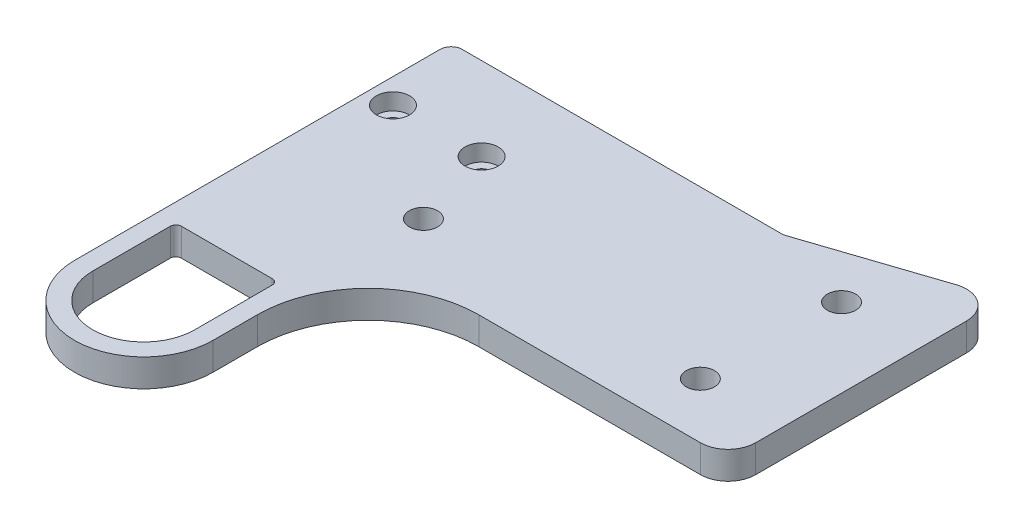
ISO-10303-21;
HEADER;
FILE_DESCRIPTION(('STEP AP214'),'2;1');
FILE_NAME('part.step','',(''),(''),'','','');
FILE_SCHEMA(('AUTOMOTIVE_DESIGN { 1 0 10303 214 1 1 1 1 }'));
ENDSEC;
DATA;
#1=APPLICATION_CONTEXT('core data for automotive mechanical design processes');
#2=APPLICATION_PROTOCOL_DEFINITION('international standard','automotive_design',2000,#1);
#3=PRODUCT_CONTEXT('',#1,'mechanical');
#4=PRODUCT('Part','Part','',(#3));
#5=PRODUCT_RELATED_PRODUCT_CATEGORY('part','',(#4));
#6=PRODUCT_DEFINITION_FORMATION('','',#4);
#7=PRODUCT_DEFINITION_CONTEXT('part definition',#1,'design');
#8=PRODUCT_DEFINITION('design','',#6,#7);
#9=PRODUCT_DEFINITION_SHAPE('','',#8);
#10=(LENGTH_UNIT() NAMED_UNIT(*) SI_UNIT(.MILLI.,.METRE.));
#11=(NAMED_UNIT(*) PLANE_ANGLE_UNIT() SI_UNIT($,.RADIAN.));
#12=(NAMED_UNIT(*) SI_UNIT($,.STERADIAN.) SOLID_ANGLE_UNIT());
#13=UNCERTAINTY_MEASURE_WITH_UNIT(LENGTH_MEASURE(1.E-05),#10,'distance_accuracy_value','');
#14=(GEOMETRIC_REPRESENTATION_CONTEXT(3) GLOBAL_UNCERTAINTY_ASSIGNED_CONTEXT((#13)) GLOBAL_UNIT_ASSIGNED_CONTEXT((#10,
#11,#12)) REPRESENTATION_CONTEXT('',''));
#15=CARTESIAN_POINT('',(0.,0.,0.));
#16=DIRECTION('',(0.,0.,1.));
#17=DIRECTION('',(1.,0.,0.));
#18=AXIS2_PLACEMENT_3D('',#15,#16,#17);
#19=CARTESIAN_POINT('',(12.5,5.,48.));
#20=DIRECTION('',(0.,1.,0.));
#21=DIRECTION('',(0.,0.,1.));
#22=AXIS2_PLACEMENT_3D('',#19,#20,#21);
#23=PLANE('',#22);
#24=CARTESIAN_POINT('',(4.50000000000001,5.,-4.99999999999998));
#25=DIRECTION('',(0.,-1.,0.));
#26=DIRECTION('',(0.,0.,-1.));
#27=AXIS2_PLACEMENT_3D('',#24,#25,#26);
#28=CIRCLE('',#27,3.);
#29=CARTESIAN_POINT('',(4.50000000000001,5.,-7.99999999999998));
#30=VERTEX_POINT('',#29);
#31=EDGE_CURVE('E391',#30,#30,#28,.T.);
#32=ORIENTED_EDGE('',*,*,#31,.T.);
#33=EDGE_LOOP('',(#32));
#34=FACE_BOUND('',#33,.T.);
#35=CARTESIAN_POINT('',(20.5,5.,-4.99999999999998));
#36=DIRECTION('',(0.,-1.,0.));
#37=DIRECTION('',(0.,0.,-1.));
#38=AXIS2_PLACEMENT_3D('',#35,#36,#37);
#39=CIRCLE('',#38,3.);
#40=CARTESIAN_POINT('',(20.5,5.,-7.99999999999998));
#41=VERTEX_POINT('',#40);
#42=EDGE_CURVE('E403',#41,#41,#39,.T.);
#43=ORIENTED_EDGE('',*,*,#42,.T.);
#44=EDGE_LOOP('',(#43));
#45=FACE_BOUND('',#44,.T.);
#46=CARTESIAN_POINT('',(4.30000000000001,5.,34.));
#47=DIRECTION('',(0.,1.,0.));
#48=DIRECTION('',(0.,0.,-1.));
#49=AXIS2_PLACEMENT_3D('',#46,#47,#48);
#50=CIRCLE('',#49,1.);
#51=CARTESIAN_POINT('',(4.30000000000001,5.,33.));
#52=VERTEX_POINT('',#51);
#53=CARTESIAN_POINT('',(3.30000000000001,5.,34.));
#54=VERTEX_POINT('',#53);
#55=EDGE_CURVE('E173',#52,#54,#50,.T.);
#56=ORIENTED_EDGE('',*,*,#55,.F.);
#57=DIRECTION('',(-1.,0.,0.));
#58=VECTOR('',#57,1.);
#59=CARTESIAN_POINT('',(4.30000000000001,5.,33.));
#60=LINE('',#59,#58);
#61=CARTESIAN_POINT('',(20.7,5.,33.));
#62=VERTEX_POINT('',#61);
#63=EDGE_CURVE('E195',#62,#52,#60,.T.);
#64=ORIENTED_EDGE('',*,*,#63,.F.);
#65=CARTESIAN_POINT('',(20.7,5.,34.));
#66=DIRECTION('',(0.,1.,0.));
#67=DIRECTION('',(0.,0.,-1.));
#68=AXIS2_PLACEMENT_3D('',#65,#66,#67);
#69=CIRCLE('',#68,1.);
#70=CARTESIAN_POINT('',(21.7,5.,34.));
#71=VERTEX_POINT('',#70);
#72=EDGE_CURVE('E199',#71,#62,#69,.T.);
#73=ORIENTED_EDGE('',*,*,#72,.F.);
#74=DIRECTION('',(0.,0.,-1.));
#75=VECTOR('',#74,1.);
#76=CARTESIAN_POINT('',(21.7,5.,34.));
#77=LINE('',#76,#75);
#78=CARTESIAN_POINT('',(21.7,5.,48.));
#79=VERTEX_POINT('',#78);
#80=EDGE_CURVE('E225',#79,#71,#77,.T.);
#81=ORIENTED_EDGE('',*,*,#80,.F.);
#82=CARTESIAN_POINT('',(12.5,5.,48.));
#83=DIRECTION('',(0.,1.,0.));
#84=DIRECTION('',(0.,0.,1.));
#85=AXIS2_PLACEMENT_3D('',#82,#83,#84);
#86=CIRCLE('',#85,9.2);
#87=CARTESIAN_POINT('',(3.30000000000001,5.,48.));
#88=VERTEX_POINT('',#87);
#89=EDGE_CURVE('E221',#88,#79,#86,.T.);
#90=ORIENTED_EDGE('',*,*,#89,.F.);
#91=DIRECTION('',(0.,0.,1.));
#92=VECTOR('',#91,1.);
#93=CARTESIAN_POINT('',(3.30000000000001,5.,48.));
#94=LINE('',#93,#92);
#95=EDGE_CURVE('E218',#54,#88,#94,.T.);
#96=ORIENTED_EDGE('',*,*,#95,.F.);
#97=EDGE_LOOP('',(#56,#64,#73,#81,#90,#96));
#98=FACE_BOUND('',#97,.T.);
#99=CARTESIAN_POINT('',(25.,5.,10.));
#100=DIRECTION('',(0.,1.,0.));
#101=DIRECTION('',(0.,0.,1.));
#102=AXIS2_PLACEMENT_3D('',#99,#100,#101);
#103=CIRCLE('',#102,2.55);
#104=CARTESIAN_POINT('',(25.,5.,12.55));
#105=VERTEX_POINT('',#104);
#106=EDGE_CURVE('E247',#105,#105,#103,.T.);
#107=ORIENTED_EDGE('',*,*,#106,.F.);
#108=EDGE_LOOP('',(#107));
#109=FACE_BOUND('',#108,.T.);
#110=CARTESIAN_POINT('',(75.7697505292423,5.,-14.7156579758528));
#111=DIRECTION('',(0.,1.,0.));
#112=DIRECTION('',(0.,0.,1.));
#113=AXIS2_PLACEMENT_3D('',#110,#111,#112);
#114=CIRCLE('',#113,2.54999999999999);
#115=CARTESIAN_POINT('',(75.7697505292423,5.,-12.1656579758528));
#116=VERTEX_POINT('',#115);
#117=EDGE_CURVE('E263',#116,#116,#114,.T.);
#118=ORIENTED_EDGE('',*,*,#117,.F.);
#119=EDGE_LOOP('',(#118));
#120=FACE_BOUND('',#119,.T.);
#121=DIRECTION('',(-1.,0.,0.));
#122=VECTOR('',#121,1.);
#123=CARTESIAN_POINT('',(0.,5.,-20.));
#124=LINE('',#123,#122);
#125=CARTESIAN_POINT('',(59.6754446796633,5.,-20.));
#126=VERTEX_POINT('',#125);
#127=CARTESIAN_POINT('',(2.,5.,-20.));
#128=VERTEX_POINT('',#127);
#129=EDGE_CURVE('E411',#126,#128,#124,.T.);
#130=ORIENTED_EDGE('',*,*,#129,.T.);
#131=CARTESIAN_POINT('',(2.,5.,-18.));
#132=DIRECTION('',(0.,1.,0.));
#133=DIRECTION('',(0.,0.,1.));
#134=AXIS2_PLACEMENT_3D('',#131,#132,#133);
#135=CIRCLE('',#134,2.);
#136=CARTESIAN_POINT('',(0.,5.,-18.));
#137=VERTEX_POINT('',#136);
#138=EDGE_CURVE('E65',#128,#137,#135,.T.);
#139=ORIENTED_EDGE('',*,*,#138,.T.);
#140=DIRECTION('',(0.,0.,1.));
#141=VECTOR('',#140,1.);
#142=CARTESIAN_POINT('',(0.,5.,0.));
#143=LINE('',#142,#141);
#144=CARTESIAN_POINT('',(0.,5.,48.));
#145=VERTEX_POINT('',#144);
#146=EDGE_CURVE('E275',#137,#145,#143,.T.);
#147=ORIENTED_EDGE('',*,*,#146,.T.);
#148=CARTESIAN_POINT('',(12.5,5.,48.));
#149=DIRECTION('',(0.,1.,0.));
#150=DIRECTION('',(0.,0.,1.));
#151=AXIS2_PLACEMENT_3D('',#148,#149,#150);
#152=CIRCLE('',#151,12.5);
#153=CARTESIAN_POINT('',(25.,5.,48.));
#154=VERTEX_POINT('',#153);
#155=EDGE_CURVE('E279',#145,#154,#152,.T.);
#156=ORIENTED_EDGE('',*,*,#155,.T.);
#157=DIRECTION('',(0.,0.,-1.));
#158=VECTOR('',#157,1.);
#159=CARTESIAN_POINT('',(25.,5.,48.));
#160=LINE('',#159,#158);
#161=CARTESIAN_POINT('',(25.,5.,40.));
#162=VERTEX_POINT('',#161);
#163=EDGE_CURVE('E282',#154,#162,#160,.T.);
#164=ORIENTED_EDGE('',*,*,#163,.T.);
#165=CARTESIAN_POINT('',(45.,5.,40.));
#166=DIRECTION('',(0.,1.,0.));
#167=DIRECTION('',(0.,0.,1.));
#168=AXIS2_PLACEMENT_3D('',#165,#166,#167);
#169=CIRCLE('',#168,20.);
#170=CARTESIAN_POINT('',(45.,5.,20.));
#171=VERTEX_POINT('',#170);
#172=EDGE_CURVE('E332',#162,#171,#169,.F.);
#173=ORIENTED_EDGE('',*,*,#172,.T.);
#174=DIRECTION('',(1.,0.,0.));
#175=VECTOR('',#174,1.);
#176=CARTESIAN_POINT('',(90.,5.,20.));
#177=LINE('',#176,#175);
#178=CARTESIAN_POINT('',(85.,5.,20.));
#179=VERTEX_POINT('',#178);
#180=EDGE_CURVE('E286',#171,#179,#177,.T.);
#181=ORIENTED_EDGE('',*,*,#180,.T.);
#182=CARTESIAN_POINT('',(85.,5.,15.));
#183=DIRECTION('',(0.,1.,0.));
#184=DIRECTION('',(0.,0.,1.));
#185=AXIS2_PLACEMENT_3D('',#182,#183,#184);
#186=CIRCLE('',#185,5.);
#187=CARTESIAN_POINT('',(90.,5.,15.));
#188=VERTEX_POINT('',#187);
#189=EDGE_CURVE('E354',#179,#188,#186,.T.);
#190=ORIENTED_EDGE('',*,*,#189,.T.);
#191=DIRECTION('',(0.,0.,-1.));
#192=VECTOR('',#191,1.);
#193=CARTESIAN_POINT('',(90.,5.,-30.));
#194=LINE('',#193,#192);
#195=CARTESIAN_POINT('',(90.,5.,-23.062870566386));
#196=VERTEX_POINT('',#195);
#197=EDGE_CURVE('E290',#188,#196,#194,.T.);
#198=ORIENTED_EDGE('',*,*,#197,.T.);
#199=CARTESIAN_POINT('',(85.,5.,-23.062870566386));
#200=DIRECTION('',(0.,1.,0.));
#201=DIRECTION('',(0.,0.,1.));
#202=AXIS2_PLACEMENT_3D('',#199,#200,#201);
#203=CIRCLE('',#202,5.);
#204=CARTESIAN_POINT('',(83.4188611699158,5.,-27.8062870566386));
#205=VERTEX_POINT('',#204);
#206=EDGE_CURVE('E351',#196,#205,#203,.T.);
#207=ORIENTED_EDGE('',*,*,#206,.T.);
#208=DIRECTION('',(-0.948683298050514,0.,0.316227766016838));
#209=VECTOR('',#208,1.);
#210=CARTESIAN_POINT('',(0.,5.,0.));
#211=LINE('',#210,#209);
#212=CARTESIAN_POINT('',(60.3079002116969,5.,-20.102633403899));
#213=VERTEX_POINT('',#212);
#214=EDGE_CURVE('E271',#205,#213,#211,.T.);
#215=ORIENTED_EDGE('',*,*,#214,.T.);
#216=CARTESIAN_POINT('',(59.6754446796633,5.,-22.));
#217=DIRECTION('',(0.,1.,0.));
#218=DIRECTION('',(0.,0.,1.));
#219=AXIS2_PLACEMENT_3D('',#216,#217,#218);
#220=CIRCLE('',#219,2.);
#221=EDGE_CURVE('E49',#213,#126,#220,.F.);
#222=ORIENTED_EDGE('',*,*,#221,.T.);
#223=EDGE_LOOP('',(#130,#139,#147,#156,#164,#173,#181,#190,#198,#207,#215,#222));
#224=FACE_BOUND('',#223,.T.);
#225=CARTESIAN_POINT('',(75.,5.,10.));
#226=DIRECTION('',(0.,1.,0.));
#227=DIRECTION('',(0.,0.,1.));
#228=AXIS2_PLACEMENT_3D('',#225,#226,#227);
#229=CIRCLE('',#228,2.54999999999999);
#230=CARTESIAN_POINT('',(75.,5.,12.55));
#231=VERTEX_POINT('',#230);
#232=EDGE_CURVE('E255',#231,#231,#229,.T.);
#233=ORIENTED_EDGE('',*,*,#232,.F.);
#234=EDGE_LOOP('',(#233));
#235=FACE_BOUND('',#234,.T.);
#236=ADVANCED_FACE('F39',(#34,#45,#98,#109,#120,#224,#235),#23,.T.);
#237=CARTESIAN_POINT('',(12.5,0.,48.));
#238=DIRECTION('',(0.,1.,0.));
#239=DIRECTION('',(0.,0.,1.));
#240=AXIS2_PLACEMENT_3D('',#237,#238,#239);
#241=PLANE('',#240);
#242=CARTESIAN_POINT('',(20.5,0.,-4.99999999999998));
#243=DIRECTION('',(0.,1.,0.));
#244=DIRECTION('',(0.,0.,1.));
#245=AXIS2_PLACEMENT_3D('',#242,#243,#244);
#246=CIRCLE('',#245,1.55);
#247=CARTESIAN_POINT('',(20.5,0.,-3.44999999999999));
#248=VERTEX_POINT('',#247);
#249=EDGE_CURVE('E407',#248,#248,#246,.T.);
#250=ORIENTED_EDGE('',*,*,#249,.T.);
#251=EDGE_LOOP('',(#250));
#252=FACE_BOUND('',#251,.T.);
#253=CARTESIAN_POINT('',(4.50000000000001,0.,-4.99999999999998));
#254=DIRECTION('',(0.,1.,0.));
#255=DIRECTION('',(0.,0.,-1.));
#256=AXIS2_PLACEMENT_3D('',#253,#254,#255);
#257=CIRCLE('',#256,1.55);
#258=CARTESIAN_POINT('',(4.50000000000001,0.,-6.54999999999998));
#259=VERTEX_POINT('',#258);
#260=EDGE_CURVE('E389',#259,#259,#257,.T.);
#261=ORIENTED_EDGE('',*,*,#260,.T.);
#262=EDGE_LOOP('',(#261));
#263=FACE_BOUND('',#262,.T.);
#264=DIRECTION('',(-1.,0.,0.));
#265=VECTOR('',#264,1.);
#266=CARTESIAN_POINT('',(4.30000000000001,0.,33.));
#267=LINE('',#266,#265);
#268=CARTESIAN_POINT('',(20.7,0.,33.));
#269=VERTEX_POINT('',#268);
#270=CARTESIAN_POINT('',(4.30000000000001,0.,33.));
#271=VERTEX_POINT('',#270);
#272=EDGE_CURVE('E179',#269,#271,#267,.T.);
#273=ORIENTED_EDGE('',*,*,#272,.T.);
#274=CARTESIAN_POINT('',(4.30000000000001,0.,34.));
#275=DIRECTION('',(0.,1.,0.));
#276=DIRECTION('',(0.,0.,-1.));
#277=AXIS2_PLACEMENT_3D('',#274,#275,#276);
#278=CIRCLE('',#277,1.);
#279=CARTESIAN_POINT('',(3.30000000000001,0.,34.));
#280=VERTEX_POINT('',#279);
#281=EDGE_CURVE('E170',#271,#280,#278,.T.);
#282=ORIENTED_EDGE('',*,*,#281,.T.);
#283=DIRECTION('',(0.,0.,1.));
#284=VECTOR('',#283,1.);
#285=CARTESIAN_POINT('',(3.30000000000001,0.,48.));
#286=LINE('',#285,#284);
#287=CARTESIAN_POINT('',(3.30000000000001,0.,48.));
#288=VERTEX_POINT('',#287);
#289=EDGE_CURVE('E183',#280,#288,#286,.T.);
#290=ORIENTED_EDGE('',*,*,#289,.T.);
#291=CARTESIAN_POINT('',(12.5,0.,48.));
#292=DIRECTION('',(0.,1.,0.));
#293=DIRECTION('',(0.,0.,1.));
#294=AXIS2_PLACEMENT_3D('',#291,#292,#293);
#295=CIRCLE('',#294,9.2);
#296=CARTESIAN_POINT('',(21.7,0.,48.));
#297=VERTEX_POINT('',#296);
#298=EDGE_CURVE('E188',#288,#297,#295,.T.);
#299=ORIENTED_EDGE('',*,*,#298,.T.);
#300=DIRECTION('',(0.,0.,-1.));
#301=VECTOR('',#300,1.);
#302=CARTESIAN_POINT('',(21.7,0.,34.));
#303=LINE('',#302,#301);
#304=CARTESIAN_POINT('',(21.7,0.,34.));
#305=VERTEX_POINT('',#304);
#306=EDGE_CURVE('E207',#297,#305,#303,.T.);
#307=ORIENTED_EDGE('',*,*,#306,.T.);
#308=CARTESIAN_POINT('',(20.7,0.,34.));
#309=DIRECTION('',(0.,1.,0.));
#310=DIRECTION('',(0.,0.,-1.));
#311=AXIS2_PLACEMENT_3D('',#308,#309,#310);
#312=CIRCLE('',#311,1.);
#313=EDGE_CURVE('E211',#305,#269,#312,.T.);
#314=ORIENTED_EDGE('',*,*,#313,.T.);
#315=EDGE_LOOP('',(#273,#282,#290,#299,#307,#314));
#316=FACE_BOUND('',#315,.T.);
#317=DIRECTION('',(0.,0.,1.));
#318=VECTOR('',#317,1.);
#319=CARTESIAN_POINT('',(0.,0.,0.));
#320=LINE('',#319,#318);
#321=CARTESIAN_POINT('',(0.,0.,-18.));
#322=VERTEX_POINT('',#321);
#323=CARTESIAN_POINT('',(0.,0.,48.));
#324=VERTEX_POINT('',#323);
#325=EDGE_CURVE('E298',#322,#324,#320,.T.);
#326=ORIENTED_EDGE('',*,*,#325,.F.);
#327=CARTESIAN_POINT('',(2.,0.,-18.));
#328=DIRECTION('',(0.,1.,0.));
#329=DIRECTION('',(0.,0.,1.));
#330=AXIS2_PLACEMENT_3D('',#327,#328,#329);
#331=CIRCLE('',#330,2.);
#332=CARTESIAN_POINT('',(2.,0.,-20.));
#333=VERTEX_POINT('',#332);
#334=EDGE_CURVE('E376',#322,#333,#331,.F.);
#335=ORIENTED_EDGE('',*,*,#334,.T.);
#336=DIRECTION('',(1.,0.,0.));
#337=VECTOR('',#336,1.);
#338=CARTESIAN_POINT('',(0.,0.,-20.));
#339=LINE('',#338,#337);
#340=CARTESIAN_POINT('',(59.6754446796633,0.,-20.));
#341=VERTEX_POINT('',#340);
#342=EDGE_CURVE('E202',#333,#341,#339,.T.);
#343=ORIENTED_EDGE('',*,*,#342,.T.);
#344=CARTESIAN_POINT('',(59.6754446796633,0.,-22.));
#345=DIRECTION('',(0.,1.,0.));
#346=DIRECTION('',(0.,0.,1.));
#347=AXIS2_PLACEMENT_3D('',#344,#345,#346);
#348=CIRCLE('',#347,2.);
#349=CARTESIAN_POINT('',(60.3079002116969,0.,-20.102633403899));
#350=VERTEX_POINT('',#349);
#351=EDGE_CURVE('E11',#341,#350,#348,.T.);
#352=ORIENTED_EDGE('',*,*,#351,.T.);
#353=DIRECTION('',(-0.948683298050514,0.,0.316227766016838));
#354=VECTOR('',#353,1.);
#355=CARTESIAN_POINT('',(0.,0.,0.));
#356=LINE('',#355,#354);
#357=CARTESIAN_POINT('',(83.4188611699158,0.,-27.8062870566386));
#358=VERTEX_POINT('',#357);
#359=EDGE_CURVE('E267',#358,#350,#356,.T.);
#360=ORIENTED_EDGE('',*,*,#359,.F.);
#361=CARTESIAN_POINT('',(85.,0.,-23.062870566386));
#362=DIRECTION('',(0.,1.,0.));
#363=DIRECTION('',(0.,0.,1.));
#364=AXIS2_PLACEMENT_3D('',#361,#362,#363);
#365=CIRCLE('',#364,5.);
#366=CARTESIAN_POINT('',(90.,0.,-23.062870566386));
#367=VERTEX_POINT('',#366);
#368=EDGE_CURVE('E342',#358,#367,#365,.F.);
#369=ORIENTED_EDGE('',*,*,#368,.T.);
#370=DIRECTION('',(0.,0.,-1.));
#371=VECTOR('',#370,1.);
#372=CARTESIAN_POINT('',(90.,0.,-30.));
#373=LINE('',#372,#371);
#374=CARTESIAN_POINT('',(90.,0.,15.));
#375=VERTEX_POINT('',#374);
#376=EDGE_CURVE('E276',#375,#367,#373,.T.);
#377=ORIENTED_EDGE('',*,*,#376,.F.);
#378=CARTESIAN_POINT('',(85.,0.,15.));
#379=DIRECTION('',(0.,1.,0.));
#380=DIRECTION('',(0.,0.,1.));
#381=AXIS2_PLACEMENT_3D('',#378,#379,#380);
#382=CIRCLE('',#381,5.);
#383=CARTESIAN_POINT('',(85.,0.,20.));
#384=VERTEX_POINT('',#383);
#385=EDGE_CURVE('E345',#375,#384,#382,.F.);
#386=ORIENTED_EDGE('',*,*,#385,.T.);
#387=DIRECTION('',(1.,0.,0.));
#388=VECTOR('',#387,1.);
#389=CARTESIAN_POINT('',(90.,0.,20.));
#390=LINE('',#389,#388);
#391=CARTESIAN_POINT('',(45.,0.,20.));
#392=VERTEX_POINT('',#391);
#393=EDGE_CURVE('E308',#392,#384,#390,.T.);
#394=ORIENTED_EDGE('',*,*,#393,.F.);
#395=CARTESIAN_POINT('',(45.,0.,40.));
#396=DIRECTION('',(0.,1.,0.));
#397=DIRECTION('',(0.,0.,1.));
#398=AXIS2_PLACEMENT_3D('',#395,#396,#397);
#399=CIRCLE('',#398,20.);
#400=CARTESIAN_POINT('',(25.,0.,40.));
#401=VERTEX_POINT('',#400);
#402=EDGE_CURVE('E329',#392,#401,#399,.T.);
#403=ORIENTED_EDGE('',*,*,#402,.T.);
#404=DIRECTION('',(0.,0.,-1.));
#405=VECTOR('',#404,1.);
#406=CARTESIAN_POINT('',(25.,0.,48.));
#407=LINE('',#406,#405);
#408=CARTESIAN_POINT('',(25.,0.,48.));
#409=VERTEX_POINT('',#408);
#410=EDGE_CURVE('E304',#409,#401,#407,.T.);
#411=ORIENTED_EDGE('',*,*,#410,.F.);
#412=CARTESIAN_POINT('',(12.5,0.,48.));
#413=DIRECTION('',(0.,1.,0.));
#414=DIRECTION('',(0.,0.,1.));
#415=AXIS2_PLACEMENT_3D('',#412,#413,#414);
#416=CIRCLE('',#415,12.5);
#417=EDGE_CURVE('E301',#324,#409,#416,.T.);
#418=ORIENTED_EDGE('',*,*,#417,.F.);
#419=EDGE_LOOP('',(#326,#335,#343,#352,#360,#369,#377,#386,#394,#403,#411,#418));
#420=FACE_BOUND('',#419,.T.);
#421=CARTESIAN_POINT('',(75.7697505292423,0.,-14.7156579758528));
#422=DIRECTION('',(0.,1.,0.));
#423=DIRECTION('',(0.,0.,1.));
#424=AXIS2_PLACEMENT_3D('',#421,#422,#423);
#425=CIRCLE('',#424,2.54999999999999);
#426=CARTESIAN_POINT('',(75.7697505292423,0.,-12.1656579758528));
#427=VERTEX_POINT('',#426);
#428=EDGE_CURVE('E259',#427,#427,#425,.T.);
#429=ORIENTED_EDGE('',*,*,#428,.T.);
#430=EDGE_LOOP('',(#429));
#431=FACE_BOUND('',#430,.T.);
#432=CARTESIAN_POINT('',(75.,0.,10.));
#433=DIRECTION('',(0.,1.,0.));
#434=DIRECTION('',(0.,0.,1.));
#435=AXIS2_PLACEMENT_3D('',#432,#433,#434);
#436=CIRCLE('',#435,2.54999999999999);
#437=CARTESIAN_POINT('',(75.,0.,12.55));
#438=VERTEX_POINT('',#437);
#439=EDGE_CURVE('E251',#438,#438,#436,.T.);
#440=ORIENTED_EDGE('',*,*,#439,.T.);
#441=EDGE_LOOP('',(#440));
#442=FACE_BOUND('',#441,.T.);
#443=CARTESIAN_POINT('',(25.,0.,10.));
#444=DIRECTION('',(0.,1.,0.));
#445=DIRECTION('',(0.,0.,1.));
#446=AXIS2_PLACEMENT_3D('',#443,#444,#445);
#447=CIRCLE('',#446,2.55);
#448=CARTESIAN_POINT('',(25.,0.,12.55));
#449=VERTEX_POINT('',#448);
#450=EDGE_CURVE('E235',#449,#449,#447,.T.);
#451=ORIENTED_EDGE('',*,*,#450,.T.);
#452=EDGE_LOOP('',(#451));
#453=FACE_BOUND('',#452,.T.);
#454=ADVANCED_FACE('F190',(#252,#263,#316,#420,#431,#442,#453),#241,.F.);
#455=CARTESIAN_POINT('',(0.,5.,0.));
#456=DIRECTION('',(0.316227766016838,0.,0.948683298050514));
#457=DIRECTION('',(0.948683298050514,0.,-0.316227766016838));
#458=AXIS2_PLACEMENT_3D('',#455,#456,#457);
#459=PLANE('',#458);
#460=ORIENTED_EDGE('',*,*,#359,.T.);
#461=DIRECTION('',(0.,1.,0.));
#462=VECTOR('',#461,1.);
#463=CARTESIAN_POINT('',(60.3079002116969,5.,-20.102633403899));
#464=LINE('',#463,#462);
#465=EDGE_CURVE('E361',#350,#213,#464,.T.);
#466=ORIENTED_EDGE('',*,*,#465,.T.);
#467=ORIENTED_EDGE('',*,*,#214,.F.);
#468=DIRECTION('',(0.,-1.,0.));
#469=VECTOR('',#468,1.);
#470=CARTESIAN_POINT('',(83.4188611699158,5.,-27.8062870566386));
#471=LINE('',#470,#469);
#472=EDGE_CURVE('E357',#205,#358,#471,.T.);
#473=ORIENTED_EDGE('',*,*,#472,.T.);
#474=EDGE_LOOP('',(#460,#466,#467,#473));
#475=FACE_BOUND('',#474,.T.);
#476=ADVANCED_FACE('F431',(#475),#459,.F.);
#477=CARTESIAN_POINT('',(0.,5.,0.));
#478=DIRECTION('',(1.,0.,0.));
#479=DIRECTION('',(0.,0.,-1.));
#480=AXIS2_PLACEMENT_3D('',#477,#478,#479);
#481=PLANE('',#480);
#482=ORIENTED_EDGE('',*,*,#146,.F.);
#483=DIRECTION('',(0.,1.,0.));
#484=VECTOR('',#483,1.);
#485=CARTESIAN_POINT('',(0.,0.,-18.));
#486=LINE('',#485,#484);
#487=EDGE_CURVE('E57',#137,#322,#486,.F.);
#488=ORIENTED_EDGE('',*,*,#487,.T.);
#489=ORIENTED_EDGE('',*,*,#325,.T.);
#490=DIRECTION('',(0.,-1.,0.));
#491=VECTOR('',#490,1.);
#492=CARTESIAN_POINT('',(0.,5.,48.));
#493=LINE('',#492,#491);
#494=EDGE_CURVE('E318',#145,#324,#493,.T.);
#495=ORIENTED_EDGE('',*,*,#494,.F.);
#496=EDGE_LOOP('',(#482,#488,#489,#495));
#497=FACE_BOUND('',#496,.T.);
#498=ADVANCED_FACE('F502',(#497),#481,.F.);
#499=CARTESIAN_POINT('',(12.5,5.,48.));
#500=DIRECTION('',(0.,-1.,0.));
#501=DIRECTION('',(0.,0.,-1.));
#502=AXIS2_PLACEMENT_3D('',#499,#500,#501);
#503=CYLINDRICAL_SURFACE('',#502,12.5);
#504=ORIENTED_EDGE('',*,*,#417,.T.);
#505=DIRECTION('',(0.,-1.,0.));
#506=VECTOR('',#505,1.);
#507=CARTESIAN_POINT('',(25.,5.,48.));
#508=LINE('',#507,#506);
#509=EDGE_CURVE('E294',#154,#409,#508,.T.);
#510=ORIENTED_EDGE('',*,*,#509,.F.);
#511=ORIENTED_EDGE('',*,*,#155,.F.);
#512=ORIENTED_EDGE('',*,*,#494,.T.);
#513=EDGE_LOOP('',(#504,#510,#511,#512));
#514=FACE_BOUND('',#513,.T.);
#515=ADVANCED_FACE('F464',(#514),#503,.T.);
#516=CARTESIAN_POINT('',(25.,5.,48.));
#517=DIRECTION('',(-1.,0.,0.));
#518=DIRECTION('',(0.,0.,1.));
#519=AXIS2_PLACEMENT_3D('',#516,#517,#518);
#520=PLANE('',#519);
#521=ORIENTED_EDGE('',*,*,#410,.T.);
#522=DIRECTION('',(0.,-1.,0.));
#523=VECTOR('',#522,1.);
#524=CARTESIAN_POINT('',(25.,5.,40.));
#525=LINE('',#524,#523);
#526=EDGE_CURVE('E326',#401,#162,#525,.F.);
#527=ORIENTED_EDGE('',*,*,#526,.T.);
#528=ORIENTED_EDGE('',*,*,#163,.F.);
#529=ORIENTED_EDGE('',*,*,#509,.T.);
#530=EDGE_LOOP('',(#521,#527,#528,#529));
#531=FACE_BOUND('',#530,.T.);
#532=ADVANCED_FACE('F459',(#531),#520,.F.);
#533=CARTESIAN_POINT('',(90.,5.,20.));
#534=DIRECTION('',(0.,0.,-1.));
#535=DIRECTION('',(-1.,0.,0.));
#536=AXIS2_PLACEMENT_3D('',#533,#534,#535);
#537=PLANE('',#536);
#538=ORIENTED_EDGE('',*,*,#393,.T.);
#539=DIRECTION('',(0.,-1.,0.));
#540=VECTOR('',#539,1.);
#541=CARTESIAN_POINT('',(85.,5.,20.));
#542=LINE('',#541,#540);
#543=EDGE_CURVE('E348',#384,#179,#542,.F.);
#544=ORIENTED_EDGE('',*,*,#543,.T.);
#545=ORIENTED_EDGE('',*,*,#180,.F.);
#546=DIRECTION('',(0.,-1.,0.));
#547=VECTOR('',#546,1.);
#548=CARTESIAN_POINT('',(45.,0.,20.));
#549=LINE('',#548,#547);
#550=EDGE_CURVE('E322',#171,#392,#549,.T.);
#551=ORIENTED_EDGE('',*,*,#550,.T.);
#552=EDGE_LOOP('',(#538,#544,#545,#551));
#553=FACE_BOUND('',#552,.T.);
#554=ADVANCED_FACE('F449',(#553),#537,.F.);
#555=CARTESIAN_POINT('',(90.,5.,-30.));
#556=DIRECTION('',(-1.,0.,0.));
#557=DIRECTION('',(0.,0.,1.));
#558=AXIS2_PLACEMENT_3D('',#555,#556,#557);
#559=PLANE('',#558);
#560=ORIENTED_EDGE('',*,*,#197,.F.);
#561=DIRECTION('',(0.,-1.,0.));
#562=VECTOR('',#561,1.);
#563=CARTESIAN_POINT('',(90.,5.,15.));
#564=LINE('',#563,#562);
#565=EDGE_CURVE('E338',#188,#375,#564,.T.);
#566=ORIENTED_EDGE('',*,*,#565,.T.);
#567=ORIENTED_EDGE('',*,*,#376,.T.);
#568=DIRECTION('',(0.,-1.,0.));
#569=VECTOR('',#568,1.);
#570=CARTESIAN_POINT('',(90.,5.,-23.062870566386));
#571=LINE('',#570,#569);
#572=EDGE_CURVE('E335',#367,#196,#571,.F.);
#573=ORIENTED_EDGE('',*,*,#572,.T.);
#574=EDGE_LOOP('',(#560,#566,#567,#573));
#575=FACE_BOUND('',#574,.T.);
#576=ADVANCED_FACE('F441',(#575),#559,.F.);
#577=CARTESIAN_POINT('',(75.7697505292423,5.,-14.7156579758528));
#578=DIRECTION('',(0.,-1.,0.));
#579=DIRECTION('',(0.,0.,-1.));
#580=AXIS2_PLACEMENT_3D('',#577,#578,#579);
#581=CYLINDRICAL_SURFACE('',#580,2.54999999999999);
#582=ORIENTED_EDGE('',*,*,#117,.T.);
#583=EDGE_LOOP('',(#582));
#584=FACE_BOUND('',#583,.T.);
#585=ORIENTED_EDGE('',*,*,#428,.F.);
#586=EDGE_LOOP('',(#585));
#587=FACE_BOUND('',#586,.T.);
#588=ADVANCED_FACE('F491',(#584,#587),#581,.F.);
#589=CARTESIAN_POINT('',(75.,5.,10.));
#590=DIRECTION('',(0.,-1.,0.));
#591=DIRECTION('',(0.,0.,-1.));
#592=AXIS2_PLACEMENT_3D('',#589,#590,#591);
#593=CYLINDRICAL_SURFACE('',#592,2.54999999999999);
#594=ORIENTED_EDGE('',*,*,#232,.T.);
#595=EDGE_LOOP('',(#594));
#596=FACE_BOUND('',#595,.T.);
#597=ORIENTED_EDGE('',*,*,#439,.F.);
#598=EDGE_LOOP('',(#597));
#599=FACE_BOUND('',#598,.T.);
#600=ADVANCED_FACE('F683',(#596,#599),#593,.F.);
#601=CARTESIAN_POINT('',(25.,5.,10.));
#602=DIRECTION('',(0.,-1.,0.));
#603=DIRECTION('',(0.,0.,-1.));
#604=AXIS2_PLACEMENT_3D('',#601,#602,#603);
#605=CYLINDRICAL_SURFACE('',#604,2.55);
#606=ORIENTED_EDGE('',*,*,#106,.T.);
#607=EDGE_LOOP('',(#606));
#608=FACE_BOUND('',#607,.T.);
#609=ORIENTED_EDGE('',*,*,#450,.F.);
#610=EDGE_LOOP('',(#609));
#611=FACE_BOUND('',#610,.T.);
#612=ADVANCED_FACE('F509',(#608,#611),#605,.F.);
#613=CARTESIAN_POINT('',(45.,5.,40.));
#614=DIRECTION('',(0.,1.,0.));
#615=DIRECTION('',(0.,0.,1.));
#616=AXIS2_PLACEMENT_3D('',#613,#614,#615);
#617=CYLINDRICAL_SURFACE('',#616,20.);
#618=ORIENTED_EDGE('',*,*,#172,.F.);
#619=ORIENTED_EDGE('',*,*,#526,.F.);
#620=ORIENTED_EDGE('',*,*,#402,.F.);
#621=ORIENTED_EDGE('',*,*,#550,.F.);
#622=EDGE_LOOP('',(#618,#619,#620,#621));
#623=FACE_BOUND('',#622,.T.);
#624=ADVANCED_FACE('F454',(#623),#617,.F.);
#625=CARTESIAN_POINT('',(85.,5.,15.));
#626=DIRECTION('',(0.,-1.,0.));
#627=DIRECTION('',(0.,0.,-1.));
#628=AXIS2_PLACEMENT_3D('',#625,#626,#627);
#629=CYLINDRICAL_SURFACE('',#628,5.);
#630=ORIENTED_EDGE('',*,*,#189,.F.);
#631=ORIENTED_EDGE('',*,*,#543,.F.);
#632=ORIENTED_EDGE('',*,*,#385,.F.);
#633=ORIENTED_EDGE('',*,*,#565,.F.);
#634=EDGE_LOOP('',(#630,#631,#632,#633));
#635=FACE_BOUND('',#634,.T.);
#636=ADVANCED_FACE('F445',(#635),#629,.T.);
#637=CARTESIAN_POINT('',(85.,5.,-23.062870566386));
#638=DIRECTION('',(0.,-1.,0.));
#639=DIRECTION('',(0.,0.,-1.));
#640=AXIS2_PLACEMENT_3D('',#637,#638,#639);
#641=CYLINDRICAL_SURFACE('',#640,5.);
#642=ORIENTED_EDGE('',*,*,#206,.F.);
#643=ORIENTED_EDGE('',*,*,#572,.F.);
#644=ORIENTED_EDGE('',*,*,#368,.F.);
#645=ORIENTED_EDGE('',*,*,#472,.F.);
#646=EDGE_LOOP('',(#642,#643,#644,#645));
#647=FACE_BOUND('',#646,.T.);
#648=ADVANCED_FACE('F438',(#647),#641,.T.);
#649=CARTESIAN_POINT('',(4.30000000000001,0.,34.));
#650=DIRECTION('',(0.,1.,0.));
#651=DIRECTION('',(0.,0.,1.));
#652=AXIS2_PLACEMENT_3D('',#649,#650,#651);
#653=CYLINDRICAL_SURFACE('',#652,1.);
#654=ORIENTED_EDGE('',*,*,#55,.T.);
#655=DIRECTION('',(0.,1.,0.));
#656=VECTOR('',#655,1.);
#657=CARTESIAN_POINT('',(3.30000000000001,0.,34.));
#658=LINE('',#657,#656);
#659=EDGE_CURVE('E166',#280,#54,#658,.T.);
#660=ORIENTED_EDGE('',*,*,#659,.F.);
#661=ORIENTED_EDGE('',*,*,#281,.F.);
#662=DIRECTION('',(0.,1.,0.));
#663=VECTOR('',#662,1.);
#664=CARTESIAN_POINT('',(4.30000000000001,0.,33.));
#665=LINE('',#664,#663);
#666=EDGE_CURVE('E232',#271,#52,#665,.T.);
#667=ORIENTED_EDGE('',*,*,#666,.T.);
#668=EDGE_LOOP('',(#654,#660,#661,#667));
#669=FACE_BOUND('',#668,.T.);
#670=ADVANCED_FACE('F168',(#669),#653,.F.);
#671=CARTESIAN_POINT('',(4.30000000000001,0.,33.));
#672=DIRECTION('',(0.,0.,-1.));
#673=DIRECTION('',(-1.,0.,0.));
#674=AXIS2_PLACEMENT_3D('',#671,#672,#673);
#675=PLANE('',#674);
#676=ORIENTED_EDGE('',*,*,#63,.T.);
#677=ORIENTED_EDGE('',*,*,#666,.F.);
#678=ORIENTED_EDGE('',*,*,#272,.F.);
#679=DIRECTION('',(0.,1.,0.));
#680=VECTOR('',#679,1.);
#681=CARTESIAN_POINT('',(20.7,0.,33.));
#682=LINE('',#681,#680);
#683=EDGE_CURVE('E236',#269,#62,#682,.T.);
#684=ORIENTED_EDGE('',*,*,#683,.T.);
#685=EDGE_LOOP('',(#676,#677,#678,#684));
#686=FACE_BOUND('',#685,.T.);
#687=ADVANCED_FACE('F642',(#686),#675,.F.);
#688=CARTESIAN_POINT('',(20.7,0.,34.));
#689=DIRECTION('',(0.,1.,0.));
#690=DIRECTION('',(0.,0.,1.));
#691=AXIS2_PLACEMENT_3D('',#688,#689,#690);
#692=CYLINDRICAL_SURFACE('',#691,1.);
#693=ORIENTED_EDGE('',*,*,#72,.T.);
#694=ORIENTED_EDGE('',*,*,#683,.F.);
#695=ORIENTED_EDGE('',*,*,#313,.F.);
#696=DIRECTION('',(0.,1.,0.));
#697=VECTOR('',#696,1.);
#698=CARTESIAN_POINT('',(21.7,0.,34.));
#699=LINE('',#698,#697);
#700=EDGE_CURVE('E239',#305,#71,#699,.T.);
#701=ORIENTED_EDGE('',*,*,#700,.T.);
#702=EDGE_LOOP('',(#693,#694,#695,#701));
#703=FACE_BOUND('',#702,.T.);
#704=ADVANCED_FACE('F633',(#703),#692,.F.);
#705=CARTESIAN_POINT('',(21.7,0.,34.));
#706=DIRECTION('',(1.,0.,0.));
#707=DIRECTION('',(0.,0.,-1.));
#708=AXIS2_PLACEMENT_3D('',#705,#706,#707);
#709=PLANE('',#708);
#710=ORIENTED_EDGE('',*,*,#80,.T.);
#711=ORIENTED_EDGE('',*,*,#700,.F.);
#712=ORIENTED_EDGE('',*,*,#306,.F.);
#713=DIRECTION('',(0.,1.,0.));
#714=VECTOR('',#713,1.);
#715=CARTESIAN_POINT('',(21.7,0.,48.));
#716=LINE('',#715,#714);
#717=EDGE_CURVE('E242',#297,#79,#716,.T.);
#718=ORIENTED_EDGE('',*,*,#717,.T.);
#719=EDGE_LOOP('',(#710,#711,#712,#718));
#720=FACE_BOUND('',#719,.T.);
#721=ADVANCED_FACE('F624',(#720),#709,.F.);
#722=CARTESIAN_POINT('',(12.5,0.,48.));
#723=DIRECTION('',(0.,1.,0.));
#724=DIRECTION('',(0.,0.,1.));
#725=AXIS2_PLACEMENT_3D('',#722,#723,#724);
#726=CYLINDRICAL_SURFACE('',#725,9.2);
#727=ORIENTED_EDGE('',*,*,#89,.T.);
#728=ORIENTED_EDGE('',*,*,#717,.F.);
#729=ORIENTED_EDGE('',*,*,#298,.F.);
#730=DIRECTION('',(0.,1.,0.));
#731=VECTOR('',#730,1.);
#732=CARTESIAN_POINT('',(3.30000000000001,0.,48.));
#733=LINE('',#732,#731);
#734=EDGE_CURVE('E178',#288,#88,#733,.T.);
#735=ORIENTED_EDGE('',*,*,#734,.T.);
#736=EDGE_LOOP('',(#727,#728,#729,#735));
#737=FACE_BOUND('',#736,.T.);
#738=ADVANCED_FACE('F478',(#737),#726,.F.);
#739=CARTESIAN_POINT('',(3.30000000000001,0.,48.));
#740=DIRECTION('',(-1.,0.,0.));
#741=DIRECTION('',(0.,0.,1.));
#742=AXIS2_PLACEMENT_3D('',#739,#740,#741);
#743=PLANE('',#742);
#744=ORIENTED_EDGE('',*,*,#95,.T.);
#745=ORIENTED_EDGE('',*,*,#734,.F.);
#746=ORIENTED_EDGE('',*,*,#289,.F.);
#747=ORIENTED_EDGE('',*,*,#659,.T.);
#748=EDGE_LOOP('',(#744,#745,#746,#747));
#749=FACE_BOUND('',#748,.T.);
#750=ADVANCED_FACE('F184',(#749),#743,.F.);
#751=CARTESIAN_POINT('',(0.,-63.2455532033676,-20.));
#752=DIRECTION('',(0.,0.,-1.));
#753=DIRECTION('',(-1.,0.,0.));
#754=AXIS2_PLACEMENT_3D('',#751,#752,#753);
#755=PLANE('',#754);
#756=ORIENTED_EDGE('',*,*,#129,.F.);
#757=DIRECTION('',(0.,1.,0.));
#758=VECTOR('',#757,1.);
#759=CARTESIAN_POINT('',(59.6754446796633,-63.2455532033676,-20.));
#760=LINE('',#759,#758);
#761=EDGE_CURVE('E369',#126,#341,#760,.F.);
#762=ORIENTED_EDGE('',*,*,#761,.T.);
#763=ORIENTED_EDGE('',*,*,#342,.F.);
#764=DIRECTION('',(0.,1.,0.));
#765=VECTOR('',#764,1.);
#766=CARTESIAN_POINT('',(2.,5.,-20.));
#767=LINE('',#766,#765);
#768=EDGE_CURVE('E365',#333,#128,#767,.T.);
#769=ORIENTED_EDGE('',*,*,#768,.T.);
#770=EDGE_LOOP('',(#756,#762,#763,#769));
#771=FACE_BOUND('',#770,.T.);
#772=ADVANCED_FACE('F467',(#771),#755,.T.);
#773=CARTESIAN_POINT('',(4.50000000000001,0.,-4.99999999999998));
#774=DIRECTION('',(0.,1.,0.));
#775=DIRECTION('',(0.,0.,1.));
#776=AXIS2_PLACEMENT_3D('',#773,#774,#775);
#777=CYLINDRICAL_SURFACE('',#776,1.55);
#778=CARTESIAN_POINT('',(4.50000000000001,2.,-4.99999999999998));
#779=DIRECTION('',(0.,-1.,0.));
#780=DIRECTION('',(0.,0.,-1.));
#781=AXIS2_PLACEMENT_3D('',#778,#779,#780);
#782=CIRCLE('',#781,1.55);
#783=CARTESIAN_POINT('',(4.50000000000001,2.,-6.54999999999998));
#784=VERTEX_POINT('',#783);
#785=EDGE_CURVE('E43',#784,#784,#782,.F.);
#786=ORIENTED_EDGE('',*,*,#785,.T.);
#787=EDGE_LOOP('',(#786));
#788=FACE_BOUND('',#787,.T.);
#789=ORIENTED_EDGE('',*,*,#260,.F.);
#790=EDGE_LOOP('',(#789));
#791=FACE_BOUND('',#790,.T.);
#792=ADVANCED_FACE('F469',(#788,#791),#777,.F.);
#793=CARTESIAN_POINT('',(20.5,0.,-4.99999999999998));
#794=DIRECTION('',(0.,1.,0.));
#795=DIRECTION('',(0.,0.,1.));
#796=AXIS2_PLACEMENT_3D('',#793,#794,#795);
#797=CYLINDRICAL_SURFACE('',#796,1.55);
#798=CARTESIAN_POINT('',(20.5,2.,-4.99999999999998));
#799=DIRECTION('',(0.,-1.,0.));
#800=DIRECTION('',(0.,0.,-1.));
#801=AXIS2_PLACEMENT_3D('',#798,#799,#800);
#802=CIRCLE('',#801,1.55);
#803=CARTESIAN_POINT('',(20.5,2.,-6.54999999999998));
#804=VERTEX_POINT('',#803);
#805=EDGE_CURVE('E380',#804,#804,#802,.F.);
#806=ORIENTED_EDGE('',*,*,#805,.T.);
#807=EDGE_LOOP('',(#806));
#808=FACE_BOUND('',#807,.T.);
#809=ORIENTED_EDGE('',*,*,#249,.F.);
#810=EDGE_LOOP('',(#809));
#811=FACE_BOUND('',#810,.T.);
#812=ADVANCED_FACE('F475',(#808,#811),#797,.F.);
#813=CARTESIAN_POINT('',(59.6754446796633,5.,-22.));
#814=DIRECTION('',(0.,1.,0.));
#815=DIRECTION('',(0.,0.,1.));
#816=AXIS2_PLACEMENT_3D('',#813,#814,#815);
#817=CYLINDRICAL_SURFACE('',#816,2.);
#818=ORIENTED_EDGE('',*,*,#351,.F.);
#819=ORIENTED_EDGE('',*,*,#761,.F.);
#820=ORIENTED_EDGE('',*,*,#221,.F.);
#821=ORIENTED_EDGE('',*,*,#465,.F.);
#822=EDGE_LOOP('',(#818,#819,#820,#821));
#823=FACE_BOUND('',#822,.T.);
#824=ADVANCED_FACE('F428',(#823),#817,.F.);
#825=CARTESIAN_POINT('',(2.,-63.2455532033676,-18.));
#826=DIRECTION('',(0.,-1.,0.));
#827=DIRECTION('',(0.,0.,-1.));
#828=AXIS2_PLACEMENT_3D('',#825,#826,#827);
#829=CYLINDRICAL_SURFACE('',#828,2.);
#830=ORIENTED_EDGE('',*,*,#334,.F.);
#831=ORIENTED_EDGE('',*,*,#487,.F.);
#832=ORIENTED_EDGE('',*,*,#138,.F.);
#833=ORIENTED_EDGE('',*,*,#768,.F.);
#834=EDGE_LOOP('',(#830,#831,#832,#833));
#835=FACE_BOUND('',#834,.T.);
#836=ADVANCED_FACE('F41',(#835),#829,.T.);
#837=CARTESIAN_POINT('',(20.5,2.,-4.99999999999998));
#838=DIRECTION('',(0.,-1.,0.));
#839=DIRECTION('',(0.,0.,-1.));
#840=AXIS2_PLACEMENT_3D('',#837,#838,#839);
#841=PLANE('',#840);
#842=CARTESIAN_POINT('',(20.5,2.,-4.99999999999998));
#843=DIRECTION('',(0.,-1.,0.));
#844=DIRECTION('',(0.,0.,-1.));
#845=AXIS2_PLACEMENT_3D('',#842,#843,#844);
#846=CIRCLE('',#845,3.);
#847=CARTESIAN_POINT('',(20.5,2.,-7.99999999999998));
#848=VERTEX_POINT('',#847);
#849=EDGE_CURVE('E397',#848,#848,#846,.T.);
#850=ORIENTED_EDGE('',*,*,#849,.F.);
#851=EDGE_LOOP('',(#850));
#852=FACE_BOUND('',#851,.T.);
#853=ORIENTED_EDGE('',*,*,#805,.F.);
#854=EDGE_LOOP('',(#853));
#855=FACE_BOUND('',#854,.T.);
#856=ADVANCED_FACE('F518',(#852,#855),#841,.F.);
#857=CARTESIAN_POINT('',(20.5,2.,-4.99999999999998));
#858=DIRECTION('',(0.,1.,0.));
#859=DIRECTION('',(0.,0.,1.));
#860=AXIS2_PLACEMENT_3D('',#857,#858,#859);
#861=CYLINDRICAL_SURFACE('',#860,3.);
#862=ORIENTED_EDGE('',*,*,#849,.T.);
#863=EDGE_LOOP('',(#862));
#864=FACE_BOUND('',#863,.T.);
#865=ORIENTED_EDGE('',*,*,#42,.F.);
#866=EDGE_LOOP('',(#865));
#867=FACE_BOUND('',#866,.T.);
#868=ADVANCED_FACE('F524',(#864,#867),#861,.F.);
#869=CARTESIAN_POINT('',(4.50000000000001,2.,-4.99999999999998));
#870=DIRECTION('',(0.,-1.,0.));
#871=DIRECTION('',(0.,0.,-1.));
#872=AXIS2_PLACEMENT_3D('',#869,#870,#871);
#873=PLANE('',#872);
#874=CARTESIAN_POINT('',(4.50000000000001,2.,-4.99999999999998));
#875=DIRECTION('',(0.,-1.,0.));
#876=DIRECTION('',(0.,0.,-1.));
#877=AXIS2_PLACEMENT_3D('',#874,#875,#876);
#878=CIRCLE('',#877,3.);
#879=CARTESIAN_POINT('',(4.50000000000001,2.,-7.99999999999998));
#880=VERTEX_POINT('',#879);
#881=EDGE_CURVE('E383',#880,#880,#878,.T.);
#882=ORIENTED_EDGE('',*,*,#881,.F.);
#883=EDGE_LOOP('',(#882));
#884=FACE_BOUND('',#883,.T.);
#885=ORIENTED_EDGE('',*,*,#785,.F.);
#886=EDGE_LOOP('',(#885));
#887=FACE_BOUND('',#886,.T.);
#888=ADVANCED_FACE('F527',(#884,#887),#873,.F.);
#889=CARTESIAN_POINT('',(4.50000000000001,2.,-4.99999999999998));
#890=DIRECTION('',(0.,1.,0.));
#891=DIRECTION('',(0.,0.,1.));
#892=AXIS2_PLACEMENT_3D('',#889,#890,#891);
#893=CYLINDRICAL_SURFACE('',#892,3.);
#894=ORIENTED_EDGE('',*,*,#881,.T.);
#895=EDGE_LOOP('',(#894));
#896=FACE_BOUND('',#895,.T.);
#897=ORIENTED_EDGE('',*,*,#31,.F.);
#898=EDGE_LOOP('',(#897));
#899=FACE_BOUND('',#898,.T.);
#900=ADVANCED_FACE('F532',(#896,#899),#893,.F.);
#901=CLOSED_SHELL('',(#236,#454,#476,#498,#515,#532,#554,#576,#588,#600,#612,#624,#636,#648,
#670,#687,#704,#721,#738,#750,#772,#792,#812,#824,#836,#856,#868,#888,#900));
#902=MANIFOLD_SOLID_BREP('B2',#901);
#903=ADVANCED_BREP_SHAPE_REPRESENTATION('',(#18,#902),#14);
#904=SHAPE_DEFINITION_REPRESENTATION(#9,#903);
ENDSEC;
END-ISO-10303-21;
